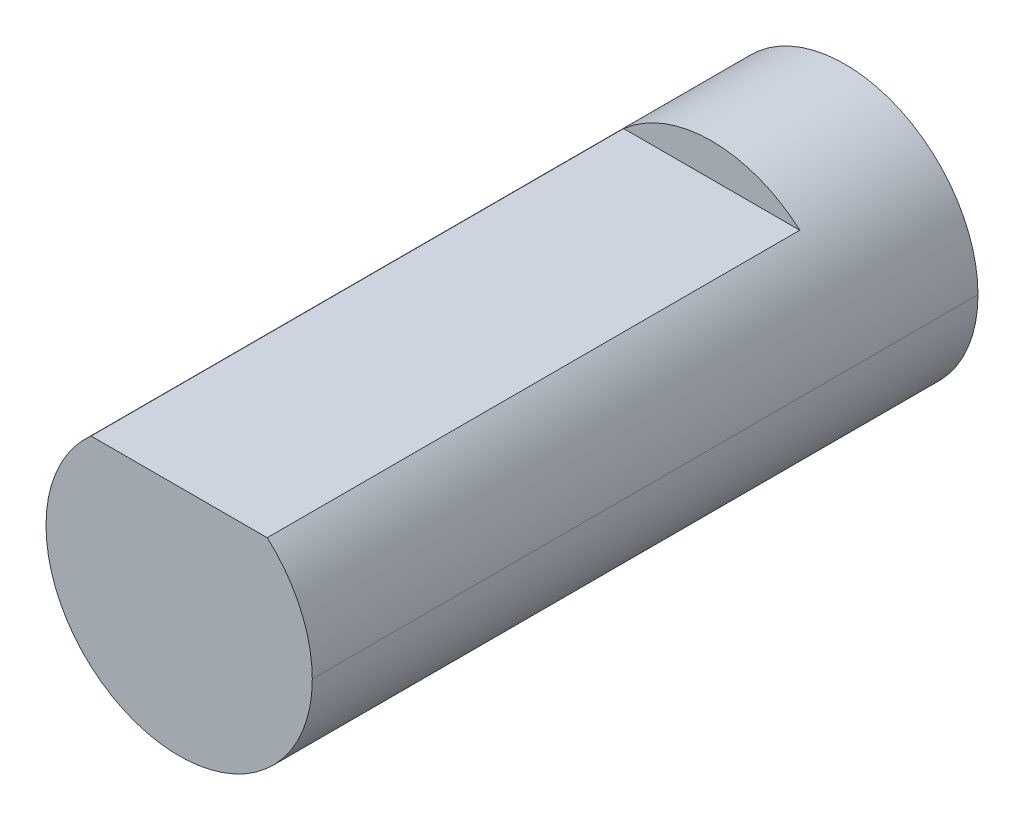
ISO-10303-21;
HEADER;
FILE_DESCRIPTION(('STEP AP214'),'2;1');
FILE_NAME('part.step','',(''),(''),'','','');
FILE_SCHEMA(('AUTOMOTIVE_DESIGN { 1 0 10303 214 1 1 1 1 }'));
ENDSEC;
DATA;
#1=APPLICATION_CONTEXT('core data for automotive mechanical design processes');
#2=APPLICATION_PROTOCOL_DEFINITION('international standard','automotive_design',2000,#1);
#3=PRODUCT_CONTEXT('',#1,'mechanical');
#4=PRODUCT('Part','Part','',(#3));
#5=PRODUCT_RELATED_PRODUCT_CATEGORY('part','',(#4));
#6=PRODUCT_DEFINITION_FORMATION('','',#4);
#7=PRODUCT_DEFINITION_CONTEXT('part definition',#1,'design');
#8=PRODUCT_DEFINITION('design','',#6,#7);
#9=PRODUCT_DEFINITION_SHAPE('','',#8);
#10=(LENGTH_UNIT() NAMED_UNIT(*) SI_UNIT(.MILLI.,.METRE.));
#11=(NAMED_UNIT(*) PLANE_ANGLE_UNIT() SI_UNIT($,.RADIAN.));
#12=(NAMED_UNIT(*) SI_UNIT($,.STERADIAN.) SOLID_ANGLE_UNIT());
#13=UNCERTAINTY_MEASURE_WITH_UNIT(LENGTH_MEASURE(1.E-05),#10,'distance_accuracy_value','');
#14=(GEOMETRIC_REPRESENTATION_CONTEXT(3) GLOBAL_UNCERTAINTY_ASSIGNED_CONTEXT((#13)) GLOBAL_UNIT_ASSIGNED_CONTEXT((#10,
#11,#12)) REPRESENTATION_CONTEXT('',''));
#15=CARTESIAN_POINT('',(0.,0.,0.));
#16=DIRECTION('',(0.,0.,1.));
#17=DIRECTION('',(1.,0.,0.));
#18=AXIS2_PLACEMENT_3D('',#15,#16,#17);
#19=CARTESIAN_POINT('',(34.375,0.,20.875));
#20=DIRECTION('',(0.,0.,1.));
#21=DIRECTION('',(1.,0.,0.));
#22=AXIS2_PLACEMENT_3D('',#19,#20,#21);
#23=PLANE('',#22);
#24=CARTESIAN_POINT('',(30.875,0.,20.875));
#25=DIRECTION('',(0.,0.,1.));
#26=DIRECTION('',(1.,0.,0.));
#27=AXIS2_PLACEMENT_3D('',#24,#25,#26);
#28=CIRCLE('',#27,2.);
#29=CARTESIAN_POINT('',(28.875,0.,20.875));
#30=VERTEX_POINT('',#29);
#31=CARTESIAN_POINT('',(32.875,0.,20.875));
#32=VERTEX_POINT('',#31);
#33=EDGE_CURVE('E47',#30,#32,#28,.F.);
#34=ORIENTED_EDGE('',*,*,#33,.T.);
#35=CARTESIAN_POINT('',(30.875,0.,20.875));
#36=DIRECTION('',(0.,0.,1.));
#37=DIRECTION('',(1.,0.,0.));
#38=AXIS2_PLACEMENT_3D('',#35,#36,#37);
#39=CIRCLE('',#38,2.);
#40=EDGE_CURVE('E11',#32,#30,#39,.F.);
#41=ORIENTED_EDGE('',*,*,#40,.T.);
#42=EDGE_LOOP('',(#34,#41));
#43=FACE_BOUND('',#42,.T.);
#44=ADVANCED_FACE('F44',(#43),#23,.F.);
#45=CARTESIAN_POINT('',(30.875,0.,22.875));
#46=DIRECTION('',(0.,0.,1.));
#47=DIRECTION('',(1.,0.,0.));
#48=AXIS2_PLACEMENT_3D('',#45,#46,#47);
#49=PLANE('',#48);
#50=CARTESIAN_POINT('',(30.875,0.,22.875));
#51=DIRECTION('',(0.,0.,1.));
#52=DIRECTION('',(1.,0.,0.));
#53=AXIS2_PLACEMENT_3D('',#50,#51,#52);
#54=CIRCLE('',#53,2.);
#55=CARTESIAN_POINT('',(32.1978756555324,1.5,22.875));
#56=VERTEX_POINT('',#55);
#57=CARTESIAN_POINT('',(29.5521243444678,1.5,22.875));
#58=VERTEX_POINT('',#57);
#59=EDGE_CURVE('E123',#56,#58,#54,.T.);
#60=ORIENTED_EDGE('',*,*,#59,.T.);
#61=DIRECTION('',(1.,0.,0.));
#62=VECTOR('',#61,1.);
#63=CARTESIAN_POINT('',(30.875,1.5,22.875));
#64=LINE('',#63,#62);
#65=EDGE_CURVE('E120',#58,#56,#64,.T.);
#66=ORIENTED_EDGE('',*,*,#65,.T.);
#67=EDGE_LOOP('',(#60,#66));
#68=FACE_BOUND('',#67,.T.);
#69=ADVANCED_FACE('F131',(#68),#49,.T.);
#70=CARTESIAN_POINT('',(30.875,1.5,22.875));
#71=DIRECTION('',(0.,-1.,0.));
#72=DIRECTION('',(-1.,0.,0.));
#73=AXIS2_PLACEMENT_3D('',#70,#71,#72);
#74=PLANE('',#73);
#75=DIRECTION('',(1.,0.,0.));
#76=VECTOR('',#75,1.);
#77=CARTESIAN_POINT('',(30.875,1.5,30.875));
#78=LINE('',#77,#76);
#79=CARTESIAN_POINT('',(29.5521243444678,1.5,30.875));
#80=VERTEX_POINT('',#79);
#81=CARTESIAN_POINT('',(32.1978756555324,1.5,30.875));
#82=VERTEX_POINT('',#81);
#83=EDGE_CURVE('E109',#80,#82,#78,.T.);
#84=ORIENTED_EDGE('',*,*,#83,.T.);
#85=DIRECTION('',(0.,0.,1.));
#86=VECTOR('',#85,1.);
#87=CARTESIAN_POINT('',(32.1978756555324,1.5,22.875));
#88=LINE('',#87,#86);
#89=EDGE_CURVE('E98',#56,#82,#88,.T.);
#90=ORIENTED_EDGE('',*,*,#89,.F.);
#91=ORIENTED_EDGE('',*,*,#65,.F.);
#92=DIRECTION('',(0.,0.,1.));
#93=VECTOR('',#92,1.);
#94=CARTESIAN_POINT('',(29.5521243444678,1.5,22.875));
#95=LINE('',#94,#93);
#96=EDGE_CURVE('E114',#58,#80,#95,.T.);
#97=ORIENTED_EDGE('',*,*,#96,.T.);
#98=EDGE_LOOP('',(#84,#90,#91,#97));
#99=FACE_BOUND('',#98,.T.);
#100=ADVANCED_FACE('F137',(#99),#74,.F.);
#101=CARTESIAN_POINT('',(30.875,0.,30.875));
#102=DIRECTION('',(0.,0.,-1.));
#103=DIRECTION('',(-1.,0.,0.));
#104=AXIS2_PLACEMENT_3D('',#101,#102,#103);
#105=PLANE('',#104);
#106=CARTESIAN_POINT('',(30.875,0.,30.875));
#107=DIRECTION('',(0.,0.,-1.));
#108=DIRECTION('',(-1.,0.,0.));
#109=AXIS2_PLACEMENT_3D('',#106,#107,#108);
#110=CIRCLE('',#109,2.);
#111=CARTESIAN_POINT('',(32.875,0.,30.875));
#112=VERTEX_POINT('',#111);
#113=EDGE_CURVE('E93',#82,#112,#110,.T.);
#114=ORIENTED_EDGE('',*,*,#113,.F.);
#115=ORIENTED_EDGE('',*,*,#83,.F.);
#116=CARTESIAN_POINT('',(30.875,0.,30.875));
#117=DIRECTION('',(0.,0.,-1.));
#118=DIRECTION('',(-1.,0.,0.));
#119=AXIS2_PLACEMENT_3D('',#116,#117,#118);
#120=CIRCLE('',#119,2.);
#121=CARTESIAN_POINT('',(28.875,0.,30.875));
#122=VERTEX_POINT('',#121);
#123=EDGE_CURVE('E107',#122,#80,#120,.T.);
#124=ORIENTED_EDGE('',*,*,#123,.F.);
#125=CARTESIAN_POINT('',(30.875,0.,30.875));
#126=DIRECTION('',(0.,0.,-1.));
#127=DIRECTION('',(-1.,0.,0.));
#128=AXIS2_PLACEMENT_3D('',#125,#126,#127);
#129=CIRCLE('',#128,2.);
#130=EDGE_CURVE('E91',#112,#122,#129,.T.);
#131=ORIENTED_EDGE('',*,*,#130,.F.);
#132=EDGE_LOOP('',(#114,#115,#124,#131));
#133=FACE_BOUND('',#132,.T.);
#134=ADVANCED_FACE('F105',(#133),#105,.F.);
#135=CARTESIAN_POINT('',(30.875,0.,18.375));
#136=DIRECTION('',(0.,0.,1.));
#137=DIRECTION('',(1.,0.,0.));
#138=AXIS2_PLACEMENT_3D('',#135,#136,#137);
#139=CYLINDRICAL_SURFACE('',#138,2.);
#140=ORIENTED_EDGE('',*,*,#33,.F.);
#141=DIRECTION('',(0.,0.,1.));
#142=VECTOR('',#141,1.);
#143=CARTESIAN_POINT('',(28.875,0.,18.375));
#144=LINE('',#143,#142);
#145=EDGE_CURVE('E119',#30,#122,#144,.T.);
#146=ORIENTED_EDGE('',*,*,#145,.T.);
#147=ORIENTED_EDGE('',*,*,#123,.T.);
#148=ORIENTED_EDGE('',*,*,#96,.F.);
#149=ORIENTED_EDGE('',*,*,#59,.F.);
#150=ORIENTED_EDGE('',*,*,#89,.T.);
#151=ORIENTED_EDGE('',*,*,#113,.T.);
#152=DIRECTION('',(0.,0.,1.));
#153=VECTOR('',#152,1.);
#154=CARTESIAN_POINT('',(32.875,0.,18.375));
#155=LINE('',#154,#153);
#156=EDGE_CURVE('E87',#32,#112,#155,.T.);
#157=ORIENTED_EDGE('',*,*,#156,.F.);
#158=EDGE_LOOP('',(#140,#146,#147,#148,#149,#150,#151,#157));
#159=FACE_BOUND('',#158,.T.);
#160=ADVANCED_FACE('F96',(#159),#139,.T.);
#161=CARTESIAN_POINT('',(30.875,0.,18.375));
#162=DIRECTION('',(0.,0.,1.));
#163=DIRECTION('',(1.,0.,0.));
#164=AXIS2_PLACEMENT_3D('',#161,#162,#163);
#165=CYLINDRICAL_SURFACE('',#164,2.);
#166=ORIENTED_EDGE('',*,*,#40,.F.);
#167=ORIENTED_EDGE('',*,*,#156,.T.);
#168=ORIENTED_EDGE('',*,*,#130,.T.);
#169=ORIENTED_EDGE('',*,*,#145,.F.);
#170=EDGE_LOOP('',(#166,#167,#168,#169));
#171=FACE_BOUND('',#170,.T.);
#172=ADVANCED_FACE('F89',(#171),#165,.T.);
#173=CLOSED_SHELL('',(#44,#69,#100,#134,#160,#172));
#174=MANIFOLD_SOLID_BREP('B2',#173);
#175=ADVANCED_BREP_SHAPE_REPRESENTATION('',(#18,#174),#14);
#176=SHAPE_DEFINITION_REPRESENTATION(#9,#175);
ENDSEC;
END-ISO-10303-21;
